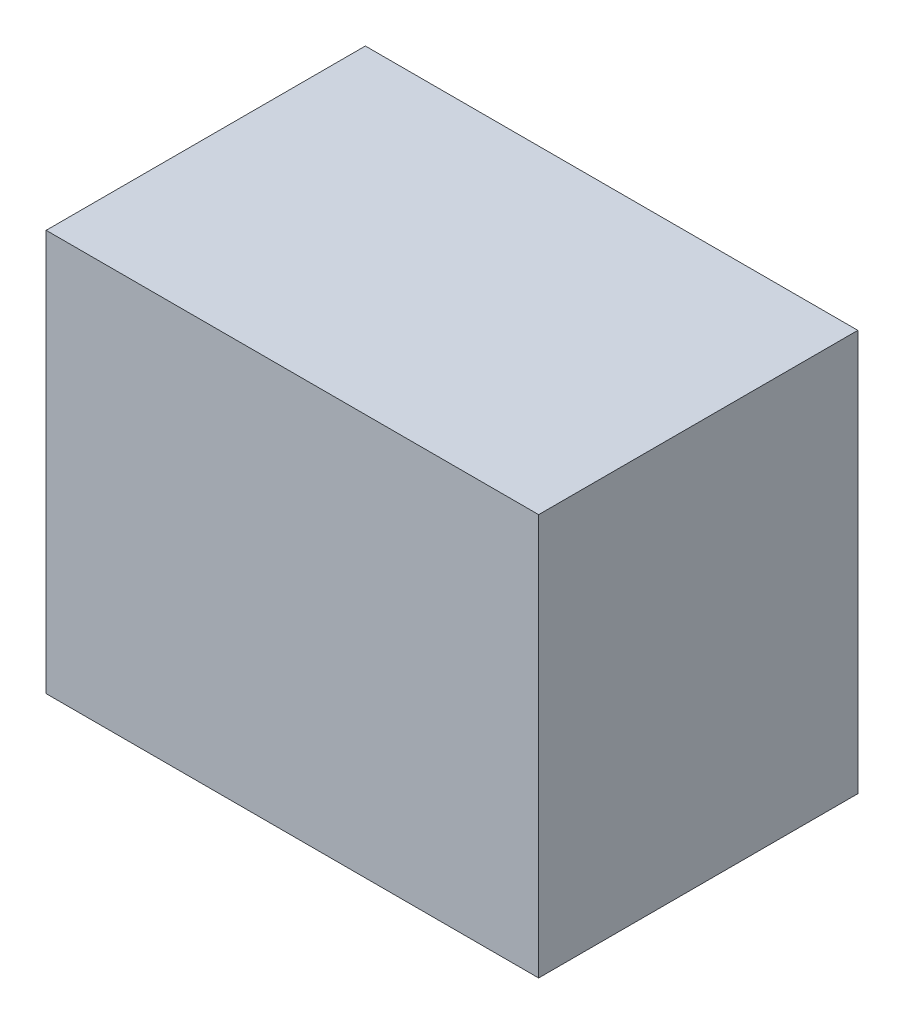
ISO-10303-21;
HEADER;
FILE_DESCRIPTION(('STEP AP214'),'2;1');
FILE_NAME('part.step','',(''),(''),'','','');
FILE_SCHEMA(('AUTOMOTIVE_DESIGN { 1 0 10303 214 1 1 1 1 }'));
ENDSEC;
DATA;
#1=APPLICATION_CONTEXT('core data for automotive mechanical design processes');
#2=APPLICATION_PROTOCOL_DEFINITION('international standard','automotive_design',2000,#1);
#3=PRODUCT_CONTEXT('',#1,'mechanical');
#4=PRODUCT('Part','Part','',(#3));
#5=PRODUCT_RELATED_PRODUCT_CATEGORY('part','',(#4));
#6=PRODUCT_DEFINITION_FORMATION('','',#4);
#7=PRODUCT_DEFINITION_CONTEXT('part definition',#1,'design');
#8=PRODUCT_DEFINITION('design','',#6,#7);
#9=PRODUCT_DEFINITION_SHAPE('','',#8);
#10=(LENGTH_UNIT() NAMED_UNIT(*) SI_UNIT(.MILLI.,.METRE.));
#11=(NAMED_UNIT(*) PLANE_ANGLE_UNIT() SI_UNIT($,.RADIAN.));
#12=(NAMED_UNIT(*) SI_UNIT($,.STERADIAN.) SOLID_ANGLE_UNIT());
#13=UNCERTAINTY_MEASURE_WITH_UNIT(LENGTH_MEASURE(1.E-05),#10,'distance_accuracy_value','');
#14=(GEOMETRIC_REPRESENTATION_CONTEXT(3) GLOBAL_UNCERTAINTY_ASSIGNED_CONTEXT((#13)) GLOBAL_UNIT_ASSIGNED_CONTEXT((#10,
#11,#12)) REPRESENTATION_CONTEXT('',''));
#15=CARTESIAN_POINT('',(0.,0.,0.));
#16=DIRECTION('',(0.,0.,1.));
#17=DIRECTION('',(1.,0.,0.));
#18=AXIS2_PLACEMENT_3D('',#15,#16,#17);
#19=CARTESIAN_POINT('',(135.,220.,-87.5));
#20=DIRECTION('',(-1.,0.,0.));
#21=DIRECTION('',(0.,0.,1.));
#22=AXIS2_PLACEMENT_3D('',#19,#20,#21);
#23=PLANE('',#22);
#24=DIRECTION('',(0.,0.,-1.));
#25=VECTOR('',#24,1.);
#26=CARTESIAN_POINT('',(135.,0.,-87.5));
#27=LINE('',#26,#25);
#28=CARTESIAN_POINT('',(135.,0.,87.5));
#29=VERTEX_POINT('',#28);
#30=CARTESIAN_POINT('',(135.,0.,-87.5));
#31=VERTEX_POINT('',#30);
#32=EDGE_CURVE('E102',#29,#31,#27,.T.);
#33=ORIENTED_EDGE('',*,*,#32,.T.);
#34=DIRECTION('',(0.,-1.,0.));
#35=VECTOR('',#34,1.);
#36=CARTESIAN_POINT('',(135.,220.,-87.5));
#37=LINE('',#36,#35);
#38=CARTESIAN_POINT('',(135.,220.,-87.5));
#39=VERTEX_POINT('',#38);
#40=EDGE_CURVE('E11',#39,#31,#37,.T.);
#41=ORIENTED_EDGE('',*,*,#40,.F.);
#42=DIRECTION('',(0.,0.,-1.));
#43=VECTOR('',#42,1.);
#44=CARTESIAN_POINT('',(135.,220.,-87.5));
#45=LINE('',#44,#43);
#46=CARTESIAN_POINT('',(135.,220.,87.5));
#47=VERTEX_POINT('',#46);
#48=EDGE_CURVE('E95',#47,#39,#45,.T.);
#49=ORIENTED_EDGE('',*,*,#48,.F.);
#50=DIRECTION('',(0.,-1.,0.));
#51=VECTOR('',#50,1.);
#52=CARTESIAN_POINT('',(135.,220.,87.5));
#53=LINE('',#52,#51);
#54=EDGE_CURVE('E97',#47,#29,#53,.T.);
#55=ORIENTED_EDGE('',*,*,#54,.T.);
#56=EDGE_LOOP('',(#33,#41,#49,#55));
#57=FACE_BOUND('',#56,.T.);
#58=ADVANCED_FACE('F41',(#57),#23,.F.);
#59=CARTESIAN_POINT('',(-135.,220.,-87.5));
#60=DIRECTION('',(0.,0.,1.));
#61=DIRECTION('',(1.,0.,0.));
#62=AXIS2_PLACEMENT_3D('',#59,#60,#61);
#63=PLANE('',#62);
#64=DIRECTION('',(-1.,0.,0.));
#65=VECTOR('',#64,1.);
#66=CARTESIAN_POINT('',(-135.,0.,-87.5));
#67=LINE('',#66,#65);
#68=CARTESIAN_POINT('',(-135.,0.,-87.5));
#69=VERTEX_POINT('',#68);
#70=EDGE_CURVE('E98',#31,#69,#67,.T.);
#71=ORIENTED_EDGE('',*,*,#70,.T.);
#72=DIRECTION('',(0.,-1.,0.));
#73=VECTOR('',#72,1.);
#74=CARTESIAN_POINT('',(-135.,220.,-87.5));
#75=LINE('',#74,#73);
#76=CARTESIAN_POINT('',(-135.,220.,-87.5));
#77=VERTEX_POINT('',#76);
#78=EDGE_CURVE('E47',#77,#69,#75,.T.);
#79=ORIENTED_EDGE('',*,*,#78,.F.);
#80=DIRECTION('',(-1.,0.,0.));
#81=VECTOR('',#80,1.);
#82=CARTESIAN_POINT('',(-135.,220.,-87.5));
#83=LINE('',#82,#81);
#84=EDGE_CURVE('E89',#39,#77,#83,.T.);
#85=ORIENTED_EDGE('',*,*,#84,.F.);
#86=ORIENTED_EDGE('',*,*,#40,.T.);
#87=EDGE_LOOP('',(#71,#79,#85,#86));
#88=FACE_BOUND('',#87,.T.);
#89=ADVANCED_FACE('F91',(#88),#63,.F.);
#90=CARTESIAN_POINT('',(-135.,220.,-87.5));
#91=DIRECTION('',(1.,0.,0.));
#92=DIRECTION('',(0.,0.,-1.));
#93=AXIS2_PLACEMENT_3D('',#90,#91,#92);
#94=PLANE('',#93);
#95=DIRECTION('',(0.,0.,1.));
#96=VECTOR('',#95,1.);
#97=CARTESIAN_POINT('',(-135.,0.,-87.5));
#98=LINE('',#97,#96);
#99=CARTESIAN_POINT('',(-135.,0.,87.5));
#100=VERTEX_POINT('',#99);
#101=EDGE_CURVE('E74',#69,#100,#98,.T.);
#102=ORIENTED_EDGE('',*,*,#101,.T.);
#103=DIRECTION('',(0.,-1.,0.));
#104=VECTOR('',#103,1.);
#105=CARTESIAN_POINT('',(-135.,220.,87.5));
#106=LINE('',#105,#104);
#107=CARTESIAN_POINT('',(-135.,220.,87.5));
#108=VERTEX_POINT('',#107);
#109=EDGE_CURVE('E100',#108,#100,#106,.T.);
#110=ORIENTED_EDGE('',*,*,#109,.F.);
#111=DIRECTION('',(0.,0.,1.));
#112=VECTOR('',#111,1.);
#113=CARTESIAN_POINT('',(-135.,220.,-87.5));
#114=LINE('',#113,#112);
#115=EDGE_CURVE('E86',#77,#108,#114,.T.);
#116=ORIENTED_EDGE('',*,*,#115,.F.);
#117=ORIENTED_EDGE('',*,*,#78,.T.);
#118=EDGE_LOOP('',(#102,#110,#116,#117));
#119=FACE_BOUND('',#118,.T.);
#120=ADVANCED_FACE('F96',(#119),#94,.F.);
#121=CARTESIAN_POINT('',(-135.,220.,87.5));
#122=DIRECTION('',(0.,0.,-1.));
#123=DIRECTION('',(-1.,0.,0.));
#124=AXIS2_PLACEMENT_3D('',#121,#122,#123);
#125=PLANE('',#124);
#126=DIRECTION('',(1.,0.,0.));
#127=VECTOR('',#126,1.);
#128=CARTESIAN_POINT('',(-135.,0.,87.5));
#129=LINE('',#128,#127);
#130=EDGE_CURVE('E79',#100,#29,#129,.T.);
#131=ORIENTED_EDGE('',*,*,#130,.T.);
#132=ORIENTED_EDGE('',*,*,#54,.F.);
#133=DIRECTION('',(1.,0.,0.));
#134=VECTOR('',#133,1.);
#135=CARTESIAN_POINT('',(-135.,220.,87.5));
#136=LINE('',#135,#134);
#137=EDGE_CURVE('E60',#108,#47,#136,.T.);
#138=ORIENTED_EDGE('',*,*,#137,.F.);
#139=ORIENTED_EDGE('',*,*,#109,.T.);
#140=EDGE_LOOP('',(#131,#132,#138,#139));
#141=FACE_BOUND('',#140,.T.);
#142=ADVANCED_FACE('F113',(#141),#125,.F.);
#143=CARTESIAN_POINT('',(0.,220.,0.));
#144=DIRECTION('',(0.,1.,0.));
#145=DIRECTION('',(0.,0.,1.));
#146=AXIS2_PLACEMENT_3D('',#143,#144,#145);
#147=PLANE('',#146);
#148=ORIENTED_EDGE('',*,*,#48,.T.);
#149=ORIENTED_EDGE('',*,*,#84,.T.);
#150=ORIENTED_EDGE('',*,*,#115,.T.);
#151=ORIENTED_EDGE('',*,*,#137,.T.);
#152=EDGE_LOOP('',(#148,#149,#150,#151));
#153=FACE_BOUND('',#152,.T.);
#154=ADVANCED_FACE('F87',(#153),#147,.T.);
#155=CARTESIAN_POINT('',(0.,0.,0.));
#156=DIRECTION('',(0.,1.,0.));
#157=DIRECTION('',(0.,0.,1.));
#158=AXIS2_PLACEMENT_3D('',#155,#156,#157);
#159=PLANE('',#158);
#160=ORIENTED_EDGE('',*,*,#32,.F.);
#161=ORIENTED_EDGE('',*,*,#130,.F.);
#162=ORIENTED_EDGE('',*,*,#101,.F.);
#163=ORIENTED_EDGE('',*,*,#70,.F.);
#164=EDGE_LOOP('',(#160,#161,#162,#163));
#165=FACE_BOUND('',#164,.T.);
#166=ADVANCED_FACE('F114',(#165),#159,.F.);
#167=CLOSED_SHELL('',(#58,#89,#120,#142,#154,#166));
#168=MANIFOLD_SOLID_BREP('B2',#167);
#169=ADVANCED_BREP_SHAPE_REPRESENTATION('',(#18,#168),#14);
#170=SHAPE_DEFINITION_REPRESENTATION(#9,#169);
ENDSEC;
END-ISO-10303-21;
